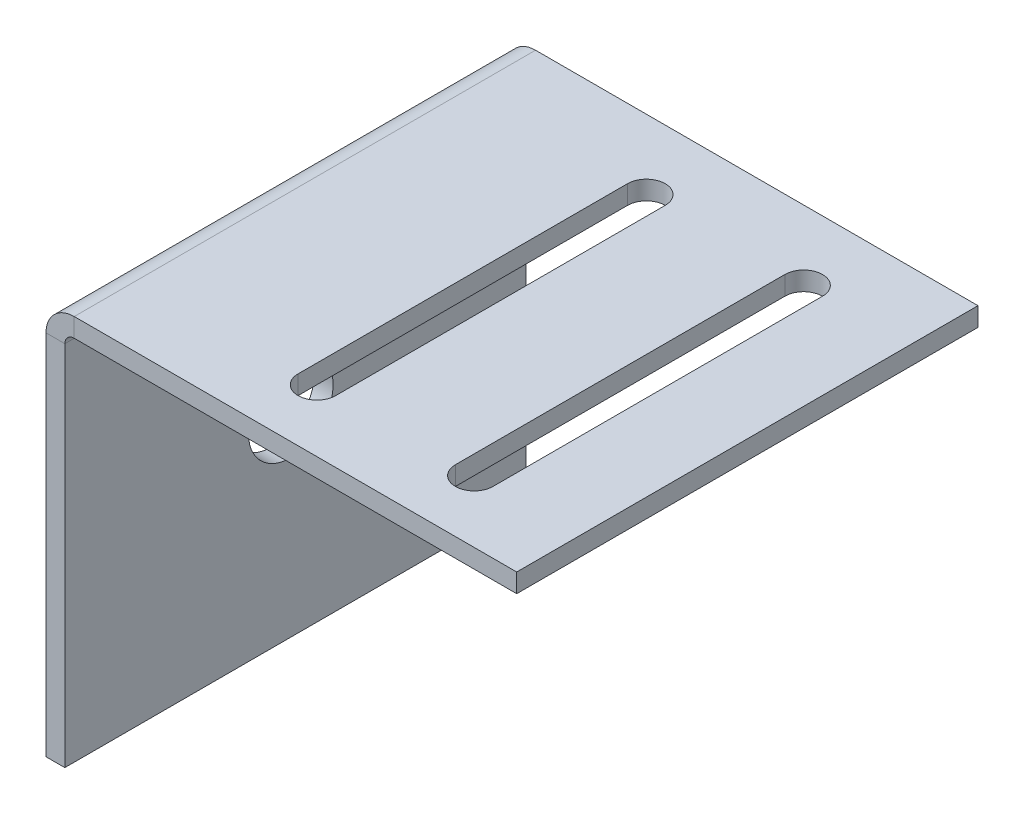
ISO-10303-21;
HEADER;
FILE_DESCRIPTION(('STEP AP214'),'2;1');
FILE_NAME('part.step','',(''),(''),'','','');
FILE_SCHEMA(('AUTOMOTIVE_DESIGN { 1 0 10303 214 1 1 1 1 }'));
ENDSEC;
DATA;
#1=APPLICATION_CONTEXT('core data for automotive mechanical design processes');
#2=APPLICATION_PROTOCOL_DEFINITION('international standard','automotive_design',2000,#1);
#3=PRODUCT_CONTEXT('',#1,'mechanical');
#4=PRODUCT('Part','Part','',(#3));
#5=PRODUCT_RELATED_PRODUCT_CATEGORY('part','',(#4));
#6=PRODUCT_DEFINITION_FORMATION('','',#4);
#7=PRODUCT_DEFINITION_CONTEXT('part definition',#1,'design');
#8=PRODUCT_DEFINITION('design','',#6,#7);
#9=PRODUCT_DEFINITION_SHAPE('','',#8);
#10=(LENGTH_UNIT() NAMED_UNIT(*) SI_UNIT(.MILLI.,.METRE.));
#11=(NAMED_UNIT(*) PLANE_ANGLE_UNIT() SI_UNIT($,.RADIAN.));
#12=(NAMED_UNIT(*) SI_UNIT($,.STERADIAN.) SOLID_ANGLE_UNIT());
#13=UNCERTAINTY_MEASURE_WITH_UNIT(LENGTH_MEASURE(1.E-05),#10,'distance_accuracy_value','');
#14=(GEOMETRIC_REPRESENTATION_CONTEXT(3) GLOBAL_UNCERTAINTY_ASSIGNED_CONTEXT((#13)) GLOBAL_UNIT_ASSIGNED_CONTEXT((#10,
#11,#12)) REPRESENTATION_CONTEXT('',''));
#15=CARTESIAN_POINT('',(0.,0.,0.));
#16=DIRECTION('',(0.,0.,1.));
#17=DIRECTION('',(1.,0.,0.));
#18=AXIS2_PLACEMENT_3D('',#15,#16,#17);
#19=CARTESIAN_POINT('',(3.,42.,49.));
#20=DIRECTION('',(0.,0.,1.));
#21=DIRECTION('',(1.,0.,0.));
#22=AXIS2_PLACEMENT_3D('',#19,#20,#21);
#23=PLANE('',#22);
#24=DIRECTION('',(0.,-1.,0.));
#25=VECTOR('',#24,1.);
#26=CARTESIAN_POINT('',(3.,42.,49.));
#27=LINE('',#26,#25);
#28=CARTESIAN_POINT('',(3.,42.,49.));
#29=VERTEX_POINT('',#28);
#30=CARTESIAN_POINT('',(3.,40.,49.));
#31=VERTEX_POINT('',#30);
#32=EDGE_CURVE('E11',#29,#31,#27,.T.);
#33=ORIENTED_EDGE('',*,*,#32,.F.);
#34=CARTESIAN_POINT('',(3.,39.,49.));
#35=DIRECTION('',(0.,0.,1.));
#36=DIRECTION('',(1.,0.,0.));
#37=AXIS2_PLACEMENT_3D('',#34,#35,#36);
#38=CIRCLE('',#37,3.);
#39=CARTESIAN_POINT('',(0.,39.,49.));
#40=VERTEX_POINT('',#39);
#41=EDGE_CURVE('E234',#40,#29,#38,.F.);
#42=ORIENTED_EDGE('',*,*,#41,.F.);
#43=DIRECTION('',(-1.,0.,0.));
#44=VECTOR('',#43,1.);
#45=CARTESIAN_POINT('',(2.,39.,49.));
#46=LINE('',#45,#44);
#47=CARTESIAN_POINT('',(2.,39.,49.));
#48=VERTEX_POINT('',#47);
#49=EDGE_CURVE('E48',#48,#40,#46,.T.);
#50=ORIENTED_EDGE('',*,*,#49,.F.);
#51=CARTESIAN_POINT('',(3.,39.,49.));
#52=DIRECTION('',(0.,0.,1.));
#53=DIRECTION('',(1.,0.,0.));
#54=AXIS2_PLACEMENT_3D('',#51,#52,#53);
#55=CIRCLE('',#54,1.);
#56=EDGE_CURVE('E246',#48,#31,#55,.F.);
#57=ORIENTED_EDGE('',*,*,#56,.T.);
#58=EDGE_LOOP('',(#33,#42,#50,#57));
#59=FACE_BOUND('',#58,.T.);
#60=ADVANCED_FACE('F40',(#59),#23,.T.);
#61=CARTESIAN_POINT('',(2.,39.,49.));
#62=DIRECTION('',(0.,0.,1.));
#63=DIRECTION('',(1.,0.,0.));
#64=AXIS2_PLACEMENT_3D('',#61,#62,#63);
#65=PLANE('',#64);
#66=DIRECTION('',(1.,0.,0.));
#67=VECTOR('',#66,1.);
#68=CARTESIAN_POINT('',(0.,42.,49.));
#69=LINE('',#68,#67);
#70=CARTESIAN_POINT('',(50.,42.,49.));
#71=VERTEX_POINT('',#70);
#72=EDGE_CURVE('E231',#29,#71,#69,.T.);
#73=ORIENTED_EDGE('',*,*,#72,.F.);
#74=ORIENTED_EDGE('',*,*,#32,.T.);
#75=DIRECTION('',(1.,0.,0.));
#76=VECTOR('',#75,1.);
#77=CARTESIAN_POINT('',(0.,40.,49.));
#78=LINE('',#77,#76);
#79=CARTESIAN_POINT('',(50.,40.,49.));
#80=VERTEX_POINT('',#79);
#81=EDGE_CURVE('E225',#31,#80,#78,.T.);
#82=ORIENTED_EDGE('',*,*,#81,.T.);
#83=DIRECTION('',(0.,-1.,0.));
#84=VECTOR('',#83,1.);
#85=CARTESIAN_POINT('',(50.,42.,49.));
#86=LINE('',#85,#84);
#87=EDGE_CURVE('E227',#71,#80,#86,.T.);
#88=ORIENTED_EDGE('',*,*,#87,.F.);
#89=EDGE_LOOP('',(#73,#74,#82,#88));
#90=FACE_BOUND('',#89,.T.);
#91=ADVANCED_FACE('F331',(#90),#65,.T.);
#92=CARTESIAN_POINT('',(0.,39.,0.));
#93=DIRECTION('',(0.,0.,-1.));
#94=DIRECTION('',(-1.,0.,0.));
#95=AXIS2_PLACEMENT_3D('',#92,#93,#94);
#96=PLANE('',#95);
#97=DIRECTION('',(1.,0.,0.));
#98=VECTOR('',#97,1.);
#99=CARTESIAN_POINT('',(0.,39.,0.));
#100=LINE('',#99,#98);
#101=CARTESIAN_POINT('',(0.,39.,0.));
#102=VERTEX_POINT('',#101);
#103=CARTESIAN_POINT('',(2.,39.,0.));
#104=VERTEX_POINT('',#103);
#105=EDGE_CURVE('E294',#102,#104,#100,.T.);
#106=ORIENTED_EDGE('',*,*,#105,.F.);
#107=CARTESIAN_POINT('',(3.,39.,0.));
#108=DIRECTION('',(0.,0.,1.));
#109=DIRECTION('',(1.,0.,0.));
#110=AXIS2_PLACEMENT_3D('',#107,#108,#109);
#111=CIRCLE('',#110,3.);
#112=CARTESIAN_POINT('',(3.,42.,0.));
#113=VERTEX_POINT('',#112);
#114=EDGE_CURVE('E259',#102,#113,#111,.F.);
#115=ORIENTED_EDGE('',*,*,#114,.T.);
#116=DIRECTION('',(0.,1.,0.));
#117=VECTOR('',#116,1.);
#118=CARTESIAN_POINT('',(3.,40.,0.));
#119=LINE('',#118,#117);
#120=CARTESIAN_POINT('',(3.,40.,0.));
#121=VERTEX_POINT('',#120);
#122=EDGE_CURVE('E292',#121,#113,#119,.T.);
#123=ORIENTED_EDGE('',*,*,#122,.F.);
#124=CARTESIAN_POINT('',(3.,39.,0.));
#125=DIRECTION('',(0.,0.,1.));
#126=DIRECTION('',(1.,0.,0.));
#127=AXIS2_PLACEMENT_3D('',#124,#125,#126);
#128=CIRCLE('',#127,1.);
#129=EDGE_CURVE('E228',#104,#121,#128,.F.);
#130=ORIENTED_EDGE('',*,*,#129,.F.);
#131=EDGE_LOOP('',(#106,#115,#123,#130));
#132=FACE_BOUND('',#131,.T.);
#133=ADVANCED_FACE('F337',(#132),#96,.T.);
#134=CARTESIAN_POINT('',(3.,40.,0.));
#135=DIRECTION('',(0.,0.,-1.));
#136=DIRECTION('',(-1.,0.,0.));
#137=AXIS2_PLACEMENT_3D('',#134,#135,#136);
#138=PLANE('',#137);
#139=DIRECTION('',(0.,1.,0.));
#140=VECTOR('',#139,1.);
#141=CARTESIAN_POINT('',(0.,0.,0.));
#142=LINE('',#141,#140);
#143=CARTESIAN_POINT('',(0.,0.,0.));
#144=VERTEX_POINT('',#143);
#145=EDGE_CURVE('E262',#144,#102,#142,.T.);
#146=ORIENTED_EDGE('',*,*,#145,.T.);
#147=ORIENTED_EDGE('',*,*,#105,.T.);
#148=DIRECTION('',(0.,1.,0.));
#149=VECTOR('',#148,1.);
#150=CARTESIAN_POINT('',(2.,0.,0.));
#151=LINE('',#150,#149);
#152=CARTESIAN_POINT('',(2.,0.,0.));
#153=VERTEX_POINT('',#152);
#154=EDGE_CURVE('E268',#153,#104,#151,.T.);
#155=ORIENTED_EDGE('',*,*,#154,.F.);
#156=DIRECTION('',(-1.,0.,0.));
#157=VECTOR('',#156,1.);
#158=CARTESIAN_POINT('',(2.,0.,0.));
#159=LINE('',#158,#157);
#160=EDGE_CURVE('E265',#153,#144,#159,.T.);
#161=ORIENTED_EDGE('',*,*,#160,.T.);
#162=EDGE_LOOP('',(#146,#147,#155,#161));
#163=FACE_BOUND('',#162,.T.);
#164=ADVANCED_FACE('F339',(#163),#138,.T.);
#165=CARTESIAN_POINT('',(0.,40.,49.));
#166=DIRECTION('',(0.,1.,0.));
#167=DIRECTION('',(0.,0.,1.));
#168=AXIS2_PLACEMENT_3D('',#165,#166,#167);
#169=PLANE('',#168);
#170=DIRECTION('',(0.,0.,-1.));
#171=VECTOR('',#170,1.);
#172=CARTESIAN_POINT('',(40.8748487091509,40.,49.));
#173=LINE('',#172,#171);
#174=CARTESIAN_POINT('',(40.8748487091509,40.,42.3889229209737));
#175=VERTEX_POINT('',#174);
#176=CARTESIAN_POINT('',(40.8748487091509,40.,7.38892292097367));
#177=VERTEX_POINT('',#176);
#178=EDGE_CURVE('E216',#175,#177,#173,.T.);
#179=ORIENTED_EDGE('',*,*,#178,.T.);
#180=CARTESIAN_POINT('',(38.8748487091509,40.,7.38892292097367));
#181=DIRECTION('',(0.,1.,0.));
#182=DIRECTION('',(0.,0.,1.));
#183=AXIS2_PLACEMENT_3D('',#180,#181,#182);
#184=CIRCLE('',#183,2.00000000000001);
#185=CARTESIAN_POINT('',(36.8748487091509,40.,7.38892292097367));
#186=VERTEX_POINT('',#185);
#187=EDGE_CURVE('E219',#177,#186,#184,.T.);
#188=ORIENTED_EDGE('',*,*,#187,.T.);
#189=DIRECTION('',(0.,0.,1.));
#190=VECTOR('',#189,1.);
#191=CARTESIAN_POINT('',(36.8748487091509,40.,49.));
#192=LINE('',#191,#190);
#193=CARTESIAN_POINT('',(36.8748487091509,40.,42.3889229209737));
#194=VERTEX_POINT('',#193);
#195=EDGE_CURVE('E213',#186,#194,#192,.T.);
#196=ORIENTED_EDGE('',*,*,#195,.T.);
#197=CARTESIAN_POINT('',(38.8748487091509,40.,42.3889229209737));
#198=DIRECTION('',(0.,1.,0.));
#199=DIRECTION('',(0.,0.,1.));
#200=AXIS2_PLACEMENT_3D('',#197,#198,#199);
#201=CIRCLE('',#200,2.00000000000001);
#202=EDGE_CURVE('E157',#194,#175,#201,.T.);
#203=ORIENTED_EDGE('',*,*,#202,.T.);
#204=EDGE_LOOP('',(#179,#188,#196,#203));
#205=FACE_BOUND('',#204,.T.);
#206=DIRECTION('',(0.,0.,-1.));
#207=VECTOR('',#206,1.);
#208=CARTESIAN_POINT('',(24.163393387809,40.,49.));
#209=LINE('',#208,#207);
#210=CARTESIAN_POINT('',(24.163393387809,40.,42.3889229209737));
#211=VERTEX_POINT('',#210);
#212=CARTESIAN_POINT('',(24.163393387809,40.,7.38892292097367));
#213=VERTEX_POINT('',#212);
#214=EDGE_CURVE('E207',#211,#213,#209,.T.);
#215=ORIENTED_EDGE('',*,*,#214,.T.);
#216=CARTESIAN_POINT('',(22.163393387809,40.,7.38892292097367));
#217=DIRECTION('',(0.,1.,0.));
#218=DIRECTION('',(0.,0.,1.));
#219=AXIS2_PLACEMENT_3D('',#216,#217,#218);
#220=CIRCLE('',#219,2.00000000000001);
#221=CARTESIAN_POINT('',(20.163393387809,40.,7.38892292097367));
#222=VERTEX_POINT('',#221);
#223=EDGE_CURVE('E210',#213,#222,#220,.T.);
#224=ORIENTED_EDGE('',*,*,#223,.T.);
#225=DIRECTION('',(0.,0.,1.));
#226=VECTOR('',#225,1.);
#227=CARTESIAN_POINT('',(20.163393387809,40.,49.));
#228=LINE('',#227,#226);
#229=CARTESIAN_POINT('',(20.163393387809,40.,42.3889229209737));
#230=VERTEX_POINT('',#229);
#231=EDGE_CURVE('E181',#222,#230,#228,.T.);
#232=ORIENTED_EDGE('',*,*,#231,.T.);
#233=CARTESIAN_POINT('',(22.163393387809,40.,42.3889229209737));
#234=DIRECTION('',(0.,1.,0.));
#235=DIRECTION('',(0.,0.,1.));
#236=AXIS2_PLACEMENT_3D('',#233,#234,#235);
#237=CIRCLE('',#236,2.00000000000001);
#238=EDGE_CURVE('E204',#230,#211,#237,.T.);
#239=ORIENTED_EDGE('',*,*,#238,.T.);
#240=EDGE_LOOP('',(#215,#224,#232,#239));
#241=FACE_BOUND('',#240,.T.);
#242=DIRECTION('',(1.,0.,0.));
#243=VECTOR('',#242,1.);
#244=CARTESIAN_POINT('',(0.,40.,0.));
#245=LINE('',#244,#243);
#246=CARTESIAN_POINT('',(50.,40.,0.));
#247=VERTEX_POINT('',#246);
#248=EDGE_CURVE('E250',#121,#247,#245,.T.);
#249=ORIENTED_EDGE('',*,*,#248,.T.);
#250=DIRECTION('',(0.,0.,-1.));
#251=VECTOR('',#250,1.);
#252=CARTESIAN_POINT('',(50.,40.,49.));
#253=LINE('',#252,#251);
#254=EDGE_CURVE('E290',#80,#247,#253,.T.);
#255=ORIENTED_EDGE('',*,*,#254,.F.);
#256=ORIENTED_EDGE('',*,*,#81,.F.);
#257=DIRECTION('',(0.,0.,-1.));
#258=VECTOR('',#257,1.);
#259=CARTESIAN_POINT('',(3.,40.,49.));
#260=LINE('',#259,#258);
#261=EDGE_CURVE('E249',#31,#121,#260,.T.);
#262=ORIENTED_EDGE('',*,*,#261,.T.);
#263=EDGE_LOOP('',(#249,#255,#256,#262));
#264=FACE_BOUND('',#263,.T.);
#265=ADVANCED_FACE('F327',(#205,#241,#264),#169,.F.);
#266=CARTESIAN_POINT('',(50.,42.,49.));
#267=DIRECTION('',(1.,0.,0.));
#268=DIRECTION('',(0.,0.,-1.));
#269=AXIS2_PLACEMENT_3D('',#266,#267,#268);
#270=PLANE('',#269);
#271=DIRECTION('',(0.,-1.,0.));
#272=VECTOR('',#271,1.);
#273=CARTESIAN_POINT('',(50.,42.,0.));
#274=LINE('',#273,#272);
#275=CARTESIAN_POINT('',(50.,42.,0.));
#276=VERTEX_POINT('',#275);
#277=EDGE_CURVE('E253',#276,#247,#274,.T.);
#278=ORIENTED_EDGE('',*,*,#277,.F.);
#279=DIRECTION('',(0.,0.,-1.));
#280=VECTOR('',#279,1.);
#281=CARTESIAN_POINT('',(50.,42.,49.));
#282=LINE('',#281,#280);
#283=EDGE_CURVE('E288',#71,#276,#282,.T.);
#284=ORIENTED_EDGE('',*,*,#283,.F.);
#285=ORIENTED_EDGE('',*,*,#87,.T.);
#286=ORIENTED_EDGE('',*,*,#254,.T.);
#287=EDGE_LOOP('',(#278,#284,#285,#286));
#288=FACE_BOUND('',#287,.T.);
#289=ADVANCED_FACE('F346',(#288),#270,.T.);
#290=CARTESIAN_POINT('',(0.,42.,49.));
#291=DIRECTION('',(0.,1.,0.));
#292=DIRECTION('',(0.,0.,1.));
#293=AXIS2_PLACEMENT_3D('',#290,#291,#292);
#294=PLANE('',#293);
#295=CARTESIAN_POINT('',(38.8748487091509,42.,7.38892292097367));
#296=DIRECTION('',(0.,1.,0.));
#297=DIRECTION('',(0.,0.,1.));
#298=AXIS2_PLACEMENT_3D('',#295,#296,#297);
#299=CIRCLE('',#298,2.00000000000001);
#300=CARTESIAN_POINT('',(40.8748487091509,42.,7.38892292097367));
#301=VERTEX_POINT('',#300);
#302=CARTESIAN_POINT('',(36.8748487091509,42.,7.38892292097367));
#303=VERTEX_POINT('',#302);
#304=EDGE_CURVE('E169',#301,#303,#299,.T.);
#305=ORIENTED_EDGE('',*,*,#304,.F.);
#306=DIRECTION('',(0.,0.,-1.));
#307=VECTOR('',#306,1.);
#308=CARTESIAN_POINT('',(40.8748487091509,42.,7.38892292097367));
#309=LINE('',#308,#307);
#310=CARTESIAN_POINT('',(40.8748487091509,42.,42.3889229209737));
#311=VERTEX_POINT('',#310);
#312=EDGE_CURVE('E174',#311,#301,#309,.T.);
#313=ORIENTED_EDGE('',*,*,#312,.F.);
#314=CARTESIAN_POINT('',(38.8748487091509,42.,42.3889229209737));
#315=DIRECTION('',(0.,1.,0.));
#316=DIRECTION('',(0.,0.,1.));
#317=AXIS2_PLACEMENT_3D('',#314,#315,#316);
#318=CIRCLE('',#317,2.00000000000001);
#319=CARTESIAN_POINT('',(36.8748487091509,42.,42.3889229209737));
#320=VERTEX_POINT('',#319);
#321=EDGE_CURVE('E154',#320,#311,#318,.T.);
#322=ORIENTED_EDGE('',*,*,#321,.F.);
#323=DIRECTION('',(0.,0.,1.));
#324=VECTOR('',#323,1.);
#325=CARTESIAN_POINT('',(36.8748487091509,42.,7.38892292097367));
#326=LINE('',#325,#324);
#327=EDGE_CURVE('E164',#303,#320,#326,.T.);
#328=ORIENTED_EDGE('',*,*,#327,.F.);
#329=EDGE_LOOP('',(#305,#313,#322,#328));
#330=FACE_BOUND('',#329,.T.);
#331=CARTESIAN_POINT('',(22.163393387809,42.,7.38892292097367));
#332=DIRECTION('',(0.,1.,0.));
#333=DIRECTION('',(0.,0.,-1.));
#334=AXIS2_PLACEMENT_3D('',#331,#332,#333);
#335=CIRCLE('',#334,2.00000000000001);
#336=CARTESIAN_POINT('',(24.163393387809,42.,7.38892292097367));
#337=VERTEX_POINT('',#336);
#338=CARTESIAN_POINT('',(20.163393387809,42.,7.38892292097367));
#339=VERTEX_POINT('',#338);
#340=EDGE_CURVE('E184',#337,#339,#335,.T.);
#341=ORIENTED_EDGE('',*,*,#340,.F.);
#342=DIRECTION('',(0.,0.,-1.));
#343=VECTOR('',#342,1.);
#344=CARTESIAN_POINT('',(24.163393387809,42.,7.38892292097367));
#345=LINE('',#344,#343);
#346=CARTESIAN_POINT('',(24.163393387809,42.,42.3889229209737));
#347=VERTEX_POINT('',#346);
#348=EDGE_CURVE('E191',#347,#337,#345,.T.);
#349=ORIENTED_EDGE('',*,*,#348,.F.);
#350=CARTESIAN_POINT('',(22.163393387809,42.,42.3889229209737));
#351=DIRECTION('',(0.,1.,0.));
#352=DIRECTION('',(0.,0.,-1.));
#353=AXIS2_PLACEMENT_3D('',#350,#351,#352);
#354=CIRCLE('',#353,2.00000000000001);
#355=CARTESIAN_POINT('',(20.163393387809,42.,42.3889229209737));
#356=VERTEX_POINT('',#355);
#357=EDGE_CURVE('E188',#356,#347,#354,.T.);
#358=ORIENTED_EDGE('',*,*,#357,.F.);
#359=DIRECTION('',(0.,0.,1.));
#360=VECTOR('',#359,1.);
#361=CARTESIAN_POINT('',(20.163393387809,42.,7.38892292097367));
#362=LINE('',#361,#360);
#363=EDGE_CURVE('E186',#339,#356,#362,.T.);
#364=ORIENTED_EDGE('',*,*,#363,.F.);
#365=EDGE_LOOP('',(#341,#349,#358,#364));
#366=FACE_BOUND('',#365,.T.);
#367=DIRECTION('',(1.,0.,0.));
#368=VECTOR('',#367,1.);
#369=CARTESIAN_POINT('',(0.,42.,0.));
#370=LINE('',#369,#368);
#371=EDGE_CURVE('E256',#113,#276,#370,.T.);
#372=ORIENTED_EDGE('',*,*,#371,.F.);
#373=DIRECTION('',(0.,0.,-1.));
#374=VECTOR('',#373,1.);
#375=CARTESIAN_POINT('',(3.,42.,49.));
#376=LINE('',#375,#374);
#377=EDGE_CURVE('E285',#29,#113,#376,.T.);
#378=ORIENTED_EDGE('',*,*,#377,.F.);
#379=ORIENTED_EDGE('',*,*,#72,.T.);
#380=ORIENTED_EDGE('',*,*,#283,.T.);
#381=EDGE_LOOP('',(#372,#378,#379,#380));
#382=FACE_BOUND('',#381,.T.);
#383=ADVANCED_FACE('F171',(#330,#366,#382),#294,.T.);
#384=CARTESIAN_POINT('',(3.,39.,49.));
#385=DIRECTION('',(0.,0.,-1.));
#386=DIRECTION('',(-1.,0.,0.));
#387=AXIS2_PLACEMENT_3D('',#384,#385,#386);
#388=CYLINDRICAL_SURFACE('',#387,3.);
#389=ORIENTED_EDGE('',*,*,#114,.F.);
#390=DIRECTION('',(0.,0.,-1.));
#391=VECTOR('',#390,1.);
#392=CARTESIAN_POINT('',(0.,39.,49.));
#393=LINE('',#392,#391);
#394=EDGE_CURVE('E282',#40,#102,#393,.T.);
#395=ORIENTED_EDGE('',*,*,#394,.F.);
#396=ORIENTED_EDGE('',*,*,#41,.T.);
#397=ORIENTED_EDGE('',*,*,#377,.T.);
#398=EDGE_LOOP('',(#389,#395,#396,#397));
#399=FACE_BOUND('',#398,.T.);
#400=ADVANCED_FACE('F307',(#399),#388,.T.);
#401=CARTESIAN_POINT('',(0.,0.,49.));
#402=DIRECTION('',(-1.,0.,0.));
#403=DIRECTION('',(0.,0.,1.));
#404=AXIS2_PLACEMENT_3D('',#401,#402,#403);
#405=PLANE('',#404);
#406=CARTESIAN_POINT('',(0.,21.,25.));
#407=DIRECTION('',(-1.,0.,0.));
#408=DIRECTION('',(0.,0.,1.));
#409=AXIS2_PLACEMENT_3D('',#406,#407,#408);
#410=CIRCLE('',#409,4.5);
#411=CARTESIAN_POINT('',(0.,21.,29.5));
#412=VERTEX_POINT('',#411);
#413=EDGE_CURVE('E222',#412,#412,#410,.T.);
#414=ORIENTED_EDGE('',*,*,#413,.F.);
#415=EDGE_LOOP('',(#414));
#416=FACE_BOUND('',#415,.T.);
#417=ORIENTED_EDGE('',*,*,#145,.F.);
#418=DIRECTION('',(0.,0.,-1.));
#419=VECTOR('',#418,1.);
#420=CARTESIAN_POINT('',(0.,0.,49.));
#421=LINE('',#420,#419);
#422=CARTESIAN_POINT('',(0.,0.,49.));
#423=VERTEX_POINT('',#422);
#424=EDGE_CURVE('E280',#423,#144,#421,.T.);
#425=ORIENTED_EDGE('',*,*,#424,.F.);
#426=DIRECTION('',(0.,1.,0.));
#427=VECTOR('',#426,1.);
#428=CARTESIAN_POINT('',(0.,0.,49.));
#429=LINE('',#428,#427);
#430=EDGE_CURVE('E237',#423,#40,#429,.T.);
#431=ORIENTED_EDGE('',*,*,#430,.T.);
#432=ORIENTED_EDGE('',*,*,#394,.T.);
#433=EDGE_LOOP('',(#417,#425,#431,#432));
#434=FACE_BOUND('',#433,.T.);
#435=ADVANCED_FACE('F311',(#416,#434),#405,.T.);
#436=CARTESIAN_POINT('',(2.,0.,49.));
#437=DIRECTION('',(0.,-1.,0.));
#438=DIRECTION('',(0.,0.,-1.));
#439=AXIS2_PLACEMENT_3D('',#436,#437,#438);
#440=PLANE('',#439);
#441=ORIENTED_EDGE('',*,*,#160,.F.);
#442=DIRECTION('',(0.,0.,-1.));
#443=VECTOR('',#442,1.);
#444=CARTESIAN_POINT('',(2.,0.,49.));
#445=LINE('',#444,#443);
#446=CARTESIAN_POINT('',(2.,0.,49.));
#447=VERTEX_POINT('',#446);
#448=EDGE_CURVE('E278',#447,#153,#445,.T.);
#449=ORIENTED_EDGE('',*,*,#448,.F.);
#450=DIRECTION('',(-1.,0.,0.));
#451=VECTOR('',#450,1.);
#452=CARTESIAN_POINT('',(2.,0.,49.));
#453=LINE('',#452,#451);
#454=EDGE_CURVE('E240',#447,#423,#453,.T.);
#455=ORIENTED_EDGE('',*,*,#454,.T.);
#456=ORIENTED_EDGE('',*,*,#424,.T.);
#457=EDGE_LOOP('',(#441,#449,#455,#456));
#458=FACE_BOUND('',#457,.T.);
#459=ADVANCED_FACE('F314',(#458),#440,.T.);
#460=CARTESIAN_POINT('',(2.,0.,49.));
#461=DIRECTION('',(-1.,0.,0.));
#462=DIRECTION('',(0.,0.,1.));
#463=AXIS2_PLACEMENT_3D('',#460,#461,#462);
#464=PLANE('',#463);
#465=CARTESIAN_POINT('',(2.,21.,25.));
#466=DIRECTION('',(-1.,0.,0.));
#467=DIRECTION('',(0.,0.,1.));
#468=AXIS2_PLACEMENT_3D('',#465,#466,#467);
#469=CIRCLE('',#468,4.5);
#470=CARTESIAN_POINT('',(2.,21.,29.5));
#471=VERTEX_POINT('',#470);
#472=EDGE_CURVE('E43',#471,#471,#469,.T.);
#473=ORIENTED_EDGE('',*,*,#472,.T.);
#474=EDGE_LOOP('',(#473));
#475=FACE_BOUND('',#474,.T.);
#476=ORIENTED_EDGE('',*,*,#154,.T.);
#477=DIRECTION('',(0.,0.,-1.));
#478=VECTOR('',#477,1.);
#479=CARTESIAN_POINT('',(2.,39.,49.));
#480=LINE('',#479,#478);
#481=EDGE_CURVE('E275',#48,#104,#480,.T.);
#482=ORIENTED_EDGE('',*,*,#481,.F.);
#483=DIRECTION('',(0.,1.,0.));
#484=VECTOR('',#483,1.);
#485=CARTESIAN_POINT('',(2.,0.,49.));
#486=LINE('',#485,#484);
#487=EDGE_CURVE('E243',#447,#48,#486,.T.);
#488=ORIENTED_EDGE('',*,*,#487,.F.);
#489=ORIENTED_EDGE('',*,*,#448,.T.);
#490=EDGE_LOOP('',(#476,#482,#488,#489));
#491=FACE_BOUND('',#490,.T.);
#492=ADVANCED_FACE('F317',(#475,#491),#464,.F.);
#493=CARTESIAN_POINT('',(3.,39.,49.));
#494=DIRECTION('',(0.,0.,-1.));
#495=DIRECTION('',(-1.,0.,0.));
#496=AXIS2_PLACEMENT_3D('',#493,#494,#495);
#497=CYLINDRICAL_SURFACE('',#496,1.);
#498=ORIENTED_EDGE('',*,*,#129,.T.);
#499=ORIENTED_EDGE('',*,*,#261,.F.);
#500=ORIENTED_EDGE('',*,*,#56,.F.);
#501=ORIENTED_EDGE('',*,*,#481,.T.);
#502=EDGE_LOOP('',(#498,#499,#500,#501));
#503=FACE_BOUND('',#502,.T.);
#504=ADVANCED_FACE('F322',(#503),#497,.F.);
#505=CARTESIAN_POINT('',(3.,39.,49.));
#506=DIRECTION('',(0.,0.,1.));
#507=DIRECTION('',(1.,0.,0.));
#508=AXIS2_PLACEMENT_3D('',#505,#506,#507);
#509=PLANE('',#508);
#510=ORIENTED_EDGE('',*,*,#487,.T.);
#511=ORIENTED_EDGE('',*,*,#49,.T.);
#512=ORIENTED_EDGE('',*,*,#430,.F.);
#513=ORIENTED_EDGE('',*,*,#454,.F.);
#514=EDGE_LOOP('',(#510,#511,#512,#513));
#515=FACE_BOUND('',#514,.T.);
#516=ADVANCED_FACE('F299',(#515),#509,.T.);
#517=CARTESIAN_POINT('',(3.,39.,0.));
#518=DIRECTION('',(0.,0.,1.));
#519=DIRECTION('',(1.,0.,0.));
#520=AXIS2_PLACEMENT_3D('',#517,#518,#519);
#521=PLANE('',#520);
#522=ORIENTED_EDGE('',*,*,#248,.F.);
#523=ORIENTED_EDGE('',*,*,#122,.T.);
#524=ORIENTED_EDGE('',*,*,#371,.T.);
#525=ORIENTED_EDGE('',*,*,#277,.T.);
#526=EDGE_LOOP('',(#522,#523,#524,#525));
#527=FACE_BOUND('',#526,.T.);
#528=ADVANCED_FACE('F419',(#527),#521,.F.);
#529=CARTESIAN_POINT('',(50.,21.,25.));
#530=DIRECTION('',(-1.,0.,0.));
#531=DIRECTION('',(0.,0.,1.));
#532=AXIS2_PLACEMENT_3D('',#529,#530,#531);
#533=CYLINDRICAL_SURFACE('',#532,4.5);
#534=ORIENTED_EDGE('',*,*,#413,.T.);
#535=EDGE_LOOP('',(#534));
#536=FACE_BOUND('',#535,.T.);
#537=ORIENTED_EDGE('',*,*,#472,.F.);
#538=EDGE_LOOP('',(#537));
#539=FACE_BOUND('',#538,.T.);
#540=ADVANCED_FACE('F429',(#536,#539),#533,.F.);
#541=CARTESIAN_POINT('',(22.163393387809,0.,7.38892292097367));
#542=DIRECTION('',(0.,1.,0.));
#543=DIRECTION('',(0.,0.,1.));
#544=AXIS2_PLACEMENT_3D('',#541,#542,#543);
#545=CYLINDRICAL_SURFACE('',#544,2.00000000000001);
#546=DIRECTION('',(0.,1.,0.));
#547=VECTOR('',#546,1.);
#548=CARTESIAN_POINT('',(24.163393387809,0.,7.38892292097367));
#549=LINE('',#548,#547);
#550=EDGE_CURVE('E195',#213,#337,#549,.T.);
#551=ORIENTED_EDGE('',*,*,#550,.T.);
#552=ORIENTED_EDGE('',*,*,#340,.T.);
#553=DIRECTION('',(0.,1.,0.));
#554=VECTOR('',#553,1.);
#555=CARTESIAN_POINT('',(20.163393387809,0.,7.38892292097367));
#556=LINE('',#555,#554);
#557=EDGE_CURVE('E194',#222,#339,#556,.T.);
#558=ORIENTED_EDGE('',*,*,#557,.F.);
#559=ORIENTED_EDGE('',*,*,#223,.F.);
#560=EDGE_LOOP('',(#551,#552,#558,#559));
#561=FACE_BOUND('',#560,.T.);
#562=ADVANCED_FACE('F455',(#561),#545,.F.);
#563=CARTESIAN_POINT('',(24.163393387809,0.,7.38892292097367));
#564=DIRECTION('',(1.,0.,0.));
#565=DIRECTION('',(0.,0.,-1.));
#566=AXIS2_PLACEMENT_3D('',#563,#564,#565);
#567=PLANE('',#566);
#568=DIRECTION('',(0.,1.,0.));
#569=VECTOR('',#568,1.);
#570=CARTESIAN_POINT('',(24.163393387809,0.,42.3889229209737));
#571=LINE('',#570,#569);
#572=EDGE_CURVE('E197',#211,#347,#571,.T.);
#573=ORIENTED_EDGE('',*,*,#572,.T.);
#574=ORIENTED_EDGE('',*,*,#348,.T.);
#575=ORIENTED_EDGE('',*,*,#550,.F.);
#576=ORIENTED_EDGE('',*,*,#214,.F.);
#577=EDGE_LOOP('',(#573,#574,#575,#576));
#578=FACE_BOUND('',#577,.T.);
#579=ADVANCED_FACE('F479',(#578),#567,.F.);
#580=CARTESIAN_POINT('',(22.163393387809,0.,42.3889229209737));
#581=DIRECTION('',(0.,1.,0.));
#582=DIRECTION('',(0.,0.,1.));
#583=AXIS2_PLACEMENT_3D('',#580,#581,#582);
#584=CYLINDRICAL_SURFACE('',#583,2.00000000000001);
#585=DIRECTION('',(0.,1.,0.));
#586=VECTOR('',#585,1.);
#587=CARTESIAN_POINT('',(20.163393387809,0.,42.3889229209737));
#588=LINE('',#587,#586);
#589=EDGE_CURVE('E63',#230,#356,#588,.T.);
#590=ORIENTED_EDGE('',*,*,#589,.T.);
#591=ORIENTED_EDGE('',*,*,#357,.T.);
#592=ORIENTED_EDGE('',*,*,#572,.F.);
#593=ORIENTED_EDGE('',*,*,#238,.F.);
#594=EDGE_LOOP('',(#590,#591,#592,#593));
#595=FACE_BOUND('',#594,.T.);
#596=ADVANCED_FACE('F490',(#595),#584,.F.);
#597=CARTESIAN_POINT('',(20.163393387809,0.,7.38892292097367));
#598=DIRECTION('',(-1.,0.,0.));
#599=DIRECTION('',(0.,0.,1.));
#600=AXIS2_PLACEMENT_3D('',#597,#598,#599);
#601=PLANE('',#600);
#602=ORIENTED_EDGE('',*,*,#557,.T.);
#603=ORIENTED_EDGE('',*,*,#363,.T.);
#604=ORIENTED_EDGE('',*,*,#589,.F.);
#605=ORIENTED_EDGE('',*,*,#231,.F.);
#606=EDGE_LOOP('',(#602,#603,#604,#605));
#607=FACE_BOUND('',#606,.T.);
#608=ADVANCED_FACE('F501',(#607),#601,.F.);
#609=CARTESIAN_POINT('',(38.8748487091509,0.,7.38892292097367));
#610=DIRECTION('',(0.,1.,0.));
#611=DIRECTION('',(0.,0.,1.));
#612=AXIS2_PLACEMENT_3D('',#609,#610,#611);
#613=CYLINDRICAL_SURFACE('',#612,2.00000000000001);
#614=DIRECTION('',(0.,1.,0.));
#615=VECTOR('',#614,1.);
#616=CARTESIAN_POINT('',(40.8748487091509,0.,7.38892292097367));
#617=LINE('',#616,#615);
#618=EDGE_CURVE('E179',#177,#301,#617,.T.);
#619=ORIENTED_EDGE('',*,*,#618,.T.);
#620=ORIENTED_EDGE('',*,*,#304,.T.);
#621=DIRECTION('',(0.,1.,0.));
#622=VECTOR('',#621,1.);
#623=CARTESIAN_POINT('',(36.8748487091509,0.,7.38892292097367));
#624=LINE('',#623,#622);
#625=EDGE_CURVE('E160',#186,#303,#624,.T.);
#626=ORIENTED_EDGE('',*,*,#625,.F.);
#627=ORIENTED_EDGE('',*,*,#187,.F.);
#628=EDGE_LOOP('',(#619,#620,#626,#627));
#629=FACE_BOUND('',#628,.T.);
#630=ADVANCED_FACE('F512',(#629),#613,.F.);
#631=CARTESIAN_POINT('',(40.8748487091509,0.,7.38892292097367));
#632=DIRECTION('',(1.,0.,0.));
#633=DIRECTION('',(0.,0.,-1.));
#634=AXIS2_PLACEMENT_3D('',#631,#632,#633);
#635=PLANE('',#634);
#636=DIRECTION('',(0.,1.,0.));
#637=VECTOR('',#636,1.);
#638=CARTESIAN_POINT('',(40.8748487091509,0.,42.3889229209737));
#639=LINE('',#638,#637);
#640=EDGE_CURVE('E159',#175,#311,#639,.T.);
#641=ORIENTED_EDGE('',*,*,#640,.T.);
#642=ORIENTED_EDGE('',*,*,#312,.T.);
#643=ORIENTED_EDGE('',*,*,#618,.F.);
#644=ORIENTED_EDGE('',*,*,#178,.F.);
#645=EDGE_LOOP('',(#641,#642,#643,#644));
#646=FACE_BOUND('',#645,.T.);
#647=ADVANCED_FACE('F522',(#646),#635,.F.);
#648=CARTESIAN_POINT('',(38.8748487091509,0.,42.3889229209737));
#649=DIRECTION('',(0.,1.,0.));
#650=DIRECTION('',(0.,0.,1.));
#651=AXIS2_PLACEMENT_3D('',#648,#649,#650);
#652=CYLINDRICAL_SURFACE('',#651,2.00000000000001);
#653=DIRECTION('',(0.,1.,0.));
#654=VECTOR('',#653,1.);
#655=CARTESIAN_POINT('',(36.8748487091509,0.,42.3889229209737));
#656=LINE('',#655,#654);
#657=EDGE_CURVE('E55',#194,#320,#656,.T.);
#658=ORIENTED_EDGE('',*,*,#657,.T.);
#659=ORIENTED_EDGE('',*,*,#321,.T.);
#660=ORIENTED_EDGE('',*,*,#640,.F.);
#661=ORIENTED_EDGE('',*,*,#202,.F.);
#662=EDGE_LOOP('',(#658,#659,#660,#661));
#663=FACE_BOUND('',#662,.T.);
#664=ADVANCED_FACE('F151',(#663),#652,.F.);
#665=CARTESIAN_POINT('',(36.8748487091509,0.,7.38892292097367));
#666=DIRECTION('',(-1.,0.,0.));
#667=DIRECTION('',(0.,0.,1.));
#668=AXIS2_PLACEMENT_3D('',#665,#666,#667);
#669=PLANE('',#668);
#670=ORIENTED_EDGE('',*,*,#625,.T.);
#671=ORIENTED_EDGE('',*,*,#327,.T.);
#672=ORIENTED_EDGE('',*,*,#657,.F.);
#673=ORIENTED_EDGE('',*,*,#195,.F.);
#674=EDGE_LOOP('',(#670,#671,#672,#673));
#675=FACE_BOUND('',#674,.T.);
#676=ADVANCED_FACE('F165',(#675),#669,.F.);
#677=CLOSED_SHELL('',(#60,#91,#133,#164,#265,#289,#383,#400,#435,#459,#492,#504,#516,#528,#540,
#562,#579,#596,#608,#630,#647,#664,#676));
#678=MANIFOLD_SOLID_BREP('B2',#677);
#679=ADVANCED_BREP_SHAPE_REPRESENTATION('',(#18,#678),#14);
#680=SHAPE_DEFINITION_REPRESENTATION(#9,#679);
ENDSEC;
END-ISO-10303-21;
